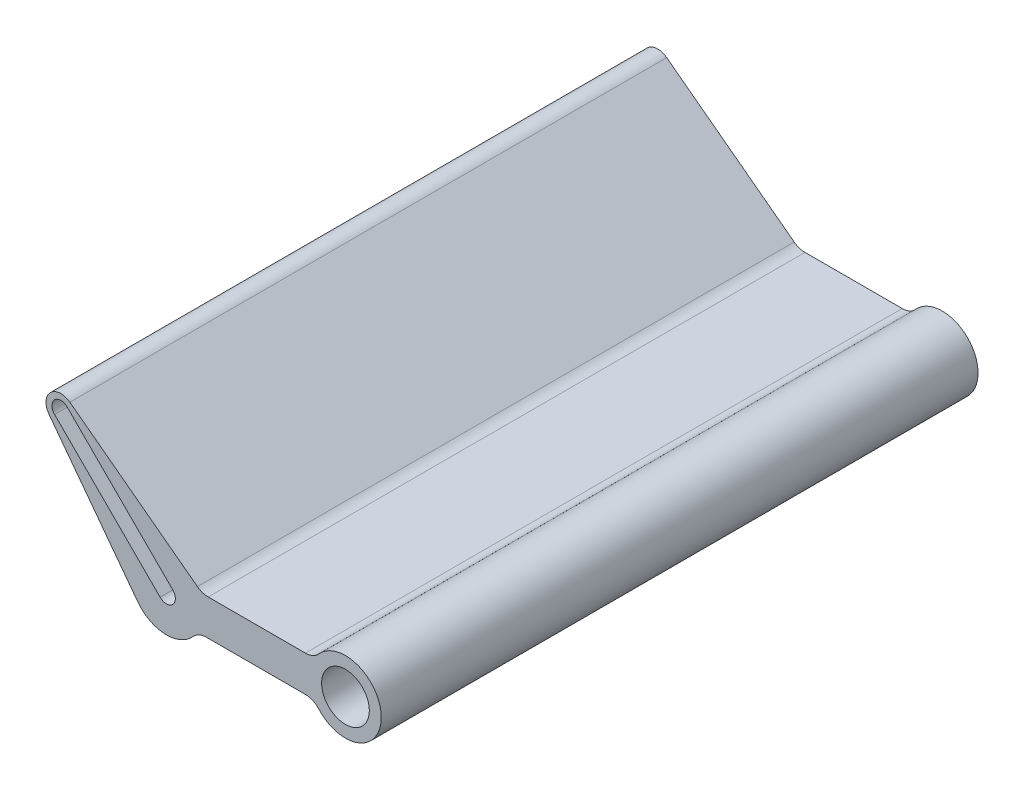
ISO-10303-21;
HEADER;
FILE_DESCRIPTION(('STEP AP214'),'2;1');
FILE_NAME('part.step','',(''),(''),'','','');
FILE_SCHEMA(('AUTOMOTIVE_DESIGN { 1 0 10303 214 1 1 1 1 }'));
ENDSEC;
DATA;
#1=APPLICATION_CONTEXT('core data for automotive mechanical design processes');
#2=APPLICATION_PROTOCOL_DEFINITION('international standard','automotive_design',2000,#1);
#3=PRODUCT_CONTEXT('',#1,'mechanical');
#4=PRODUCT('Part','Part','',(#3));
#5=PRODUCT_RELATED_PRODUCT_CATEGORY('part','',(#4));
#6=PRODUCT_DEFINITION_FORMATION('','',#4);
#7=PRODUCT_DEFINITION_CONTEXT('part definition',#1,'design');
#8=PRODUCT_DEFINITION('design','',#6,#7);
#9=PRODUCT_DEFINITION_SHAPE('','',#8);
#10=(LENGTH_UNIT() NAMED_UNIT(*) SI_UNIT(.MILLI.,.METRE.));
#11=(NAMED_UNIT(*) PLANE_ANGLE_UNIT() SI_UNIT($,.RADIAN.));
#12=(NAMED_UNIT(*) SI_UNIT($,.STERADIAN.) SOLID_ANGLE_UNIT());
#13=UNCERTAINTY_MEASURE_WITH_UNIT(LENGTH_MEASURE(1.E-05),#10,'distance_accuracy_value','');
#14=(GEOMETRIC_REPRESENTATION_CONTEXT(3) GLOBAL_UNCERTAINTY_ASSIGNED_CONTEXT((#13)) GLOBAL_UNIT_ASSIGNED_CONTEXT((#10,
#11,#12)) REPRESENTATION_CONTEXT('',''));
#15=CARTESIAN_POINT('',(0.,0.,0.));
#16=DIRECTION('',(0.,0.,1.));
#17=DIRECTION('',(1.,0.,0.));
#18=AXIS2_PLACEMENT_3D('',#15,#16,#17);
#19=CARTESIAN_POINT('',(0.,0.,1000.));
#20=DIRECTION('',(0.,0.,1.));
#21=DIRECTION('',(1.,0.,0.));
#22=AXIS2_PLACEMENT_3D('',#19,#20,#21);
#23=PLANE('',#22);
#24=DIRECTION('',(-0.707106781186547,0.707106781186548,0.));
#25=VECTOR('',#24,1.);
#26=CARTESIAN_POINT('',(10.6066017177982,10.6066017177982,1000.));
#27=LINE('',#26,#25);
#28=CARTESIAN_POINT('',(10.6066017177982,10.6066017177982,1000.));
#29=VERTEX_POINT('',#28);
#30=CARTESIAN_POINT('',(-166.170093578839,187.383297014435,1000.));
#31=VERTEX_POINT('',#30);
#32=EDGE_CURVE('E148',#29,#31,#27,.T.);
#33=ORIENTED_EDGE('',*,*,#32,.F.);
#34=CARTESIAN_POINT('',(0.,0.,1000.));
#35=DIRECTION('',(0.,0.,1.));
#36=DIRECTION('',(1.,0.,0.));
#37=AXIS2_PLACEMENT_3D('',#34,#35,#36);
#38=CIRCLE('',#37,15.);
#39=CARTESIAN_POINT('',(-10.6066017177982,-10.6066017177982,1000.));
#40=VERTEX_POINT('',#39);
#41=EDGE_CURVE('E140',#40,#29,#38,.T.);
#42=ORIENTED_EDGE('',*,*,#41,.F.);
#43=DIRECTION('',(0.707106781186548,-0.707106781186548,0.));
#44=VECTOR('',#43,1.);
#45=CARTESIAN_POINT('',(-10.6066017177982,-10.6066017177982,1000.));
#46=LINE('',#45,#44);
#47=CARTESIAN_POINT('',(-187.383297014435,166.170093578839,1000.));
#48=VERTEX_POINT('',#47);
#49=EDGE_CURVE('E163',#48,#40,#46,.T.);
#50=ORIENTED_EDGE('',*,*,#49,.F.);
#51=CARTESIAN_POINT('',(-176.776695296637,176.776695296637,1000.));
#52=DIRECTION('',(0.,0.,1.));
#53=DIRECTION('',(1.,0.,0.));
#54=AXIS2_PLACEMENT_3D('',#51,#52,#53);
#55=CIRCLE('',#54,15.);
#56=EDGE_CURVE('E161',#31,#48,#55,.T.);
#57=ORIENTED_EDGE('',*,*,#56,.F.);
#58=EDGE_LOOP('',(#33,#42,#50,#57));
#59=FACE_BOUND('',#58,.T.);
#60=CARTESIAN_POINT('',(0.,0.,1000.));
#61=DIRECTION('',(0.,0.,1.));
#62=DIRECTION('',(1.,0.,0.));
#63=AXIS2_PLACEMENT_3D('',#60,#61,#62);
#64=CIRCLE('',#63,60.);
#65=CARTESIAN_POINT('',(-47.9482675160813,-36.0688735921473,1000.));
#66=VERTEX_POINT('',#65);
#67=CARTESIAN_POINT('',(44.7213595499958,-40.,1000.));
#68=VERTEX_POINT('',#67);
#69=EDGE_CURVE('E179',#66,#68,#64,.T.);
#70=ORIENTED_EDGE('',*,*,#69,.T.);
#71=CARTESIAN_POINT('',(67.0820393249937,-60.,1000.));
#72=DIRECTION('',(0.,0.,-1.));
#73=DIRECTION('',(1.,0.,0.));
#74=AXIS2_PLACEMENT_3D('',#71,#72,#73);
#75=CIRCLE('',#74,30.);
#76=CARTESIAN_POINT('',(67.0820393249937,-30.,1000.));
#77=VERTEX_POINT('',#76);
#78=EDGE_CURVE('E182',#68,#77,#75,.T.);
#79=ORIENTED_EDGE('',*,*,#78,.T.);
#80=DIRECTION('',(1.,0.,0.));
#81=VECTOR('',#80,1.);
#82=CARTESIAN_POINT('',(67.0820393249937,-30.,1000.));
#83=LINE('',#82,#81);
#84=CARTESIAN_POINT('',(232.917960675006,-30.,1000.));
#85=VERTEX_POINT('',#84);
#86=EDGE_CURVE('E185',#77,#85,#83,.T.);
#87=ORIENTED_EDGE('',*,*,#86,.T.);
#88=CARTESIAN_POINT('',(232.917960675006,-60.,1000.));
#89=DIRECTION('',(0.,0.,-1.));
#90=DIRECTION('',(1.,0.,0.));
#91=AXIS2_PLACEMENT_3D('',#88,#89,#90);
#92=CIRCLE('',#91,30.);
#93=CARTESIAN_POINT('',(255.278640450004,-40.,1000.));
#94=VERTEX_POINT('',#93);
#95=EDGE_CURVE('E187',#85,#94,#92,.T.);
#96=ORIENTED_EDGE('',*,*,#95,.T.);
#97=CARTESIAN_POINT('',(300.,0.,1000.));
#98=DIRECTION('',(0.,0.,1.));
#99=DIRECTION('',(1.,0.,0.));
#100=AXIS2_PLACEMENT_3D('',#97,#98,#99);
#101=CIRCLE('',#100,60.);
#102=CARTESIAN_POINT('',(255.278640450004,40.,1000.));
#103=VERTEX_POINT('',#102);
#104=EDGE_CURVE('E189',#94,#103,#101,.T.);
#105=ORIENTED_EDGE('',*,*,#104,.T.);
#106=CARTESIAN_POINT('',(232.917960675006,60.,1000.));
#107=DIRECTION('',(0.,0.,-1.));
#108=DIRECTION('',(1.,0.,0.));
#109=AXIS2_PLACEMENT_3D('',#106,#107,#108);
#110=CIRCLE('',#109,30.);
#111=CARTESIAN_POINT('',(232.917960675006,30.,1000.));
#112=VERTEX_POINT('',#111);
#113=EDGE_CURVE('E191',#103,#112,#110,.T.);
#114=ORIENTED_EDGE('',*,*,#113,.T.);
#115=DIRECTION('',(-1.,0.,0.));
#116=VECTOR('',#115,1.);
#117=CARTESIAN_POINT('',(69.9523910162928,30.,1000.));
#118=LINE('',#117,#116);
#119=CARTESIAN_POINT('',(69.9523910162928,30.,1000.));
#120=VERTEX_POINT('',#119);
#121=EDGE_CURVE('E193',#112,#120,#118,.T.);
#122=ORIENTED_EDGE('',*,*,#121,.T.);
#123=CARTESIAN_POINT('',(69.9523910162927,60.,1000.));
#124=DIRECTION('',(0.,0.,-1.));
#125=DIRECTION('',(1.,0.,0.));
#126=AXIS2_PLACEMENT_3D('',#123,#124,#125);
#127=CIRCLE('',#126,30.);
#128=CARTESIAN_POINT('',(51.917954220219,36.0258662419594,1000.));
#129=VERTEX_POINT('',#128);
#130=EDGE_CURVE('E195',#120,#129,#127,.T.);
#131=ORIENTED_EDGE('',*,*,#130,.T.);
#132=DIRECTION('',(-0.799137791934689,0.601147893202455,0.));
#133=VECTOR('',#132,1.);
#134=CARTESIAN_POINT('',(51.917954220219,36.0258662419594,1000.));
#135=LINE('',#134,#133);
#136=CARTESIAN_POINT('',(-161.747997966575,196.755140095004,1000.));
#137=VERTEX_POINT('',#136);
#138=EDGE_CURVE('E197',#129,#137,#135,.T.);
#139=ORIENTED_EDGE('',*,*,#138,.T.);
#140=CARTESIAN_POINT('',(-176.776695296637,176.776695296637,1000.));
#141=DIRECTION('',(0.,0.,1.));
#142=DIRECTION('',(1.,0.,0.));
#143=AXIS2_PLACEMENT_3D('',#140,#141,#142);
#144=CIRCLE('',#143,25.);
#145=CARTESIAN_POINT('',(-196.755140095004,161.747997966575,1000.));
#146=VERTEX_POINT('',#145);
#147=EDGE_CURVE('E199',#137,#146,#144,.T.);
#148=ORIENTED_EDGE('',*,*,#147,.T.);
#149=DIRECTION('',(0.601147893202455,-0.799137791934688,0.));
#150=VECTOR('',#149,1.);
#151=CARTESIAN_POINT('',(-47.9482675160813,-36.0688735921473,1000.));
#152=LINE('',#151,#150);
#153=EDGE_CURVE('E201',#146,#66,#152,.T.);
#154=ORIENTED_EDGE('',*,*,#153,.T.);
#155=EDGE_LOOP('',(#70,#79,#87,#96,#105,#114,#122,#131,#139,#148,#154));
#156=FACE_BOUND('',#155,.T.);
#157=CARTESIAN_POINT('',(300.,0.,1000.));
#158=DIRECTION('',(0.,0.,1.));
#159=DIRECTION('',(1.,0.,0.));
#160=AXIS2_PLACEMENT_3D('',#157,#158,#159);
#161=CIRCLE('',#160,40.);
#162=CARTESIAN_POINT('',(340.,0.,1000.));
#163=VERTEX_POINT('',#162);
#164=EDGE_CURVE('E169',#163,#163,#161,.T.);
#165=ORIENTED_EDGE('',*,*,#164,.F.);
#166=EDGE_LOOP('',(#165));
#167=FACE_BOUND('',#166,.T.);
#168=ADVANCED_FACE('F33',(#59,#156,#167),#23,.T.);
#169=CARTESIAN_POINT('',(0.,0.,0.));
#170=DIRECTION('',(0.,0.,1.));
#171=DIRECTION('',(1.,0.,0.));
#172=AXIS2_PLACEMENT_3D('',#169,#170,#171);
#173=PLANE('',#172);
#174=CARTESIAN_POINT('',(0.,0.,0.));
#175=DIRECTION('',(0.,0.,1.));
#176=DIRECTION('',(1.,0.,0.));
#177=AXIS2_PLACEMENT_3D('',#174,#175,#176);
#178=CIRCLE('',#177,15.);
#179=CARTESIAN_POINT('',(-10.6066017177982,-10.6066017177982,0.));
#180=VERTEX_POINT('',#179);
#181=CARTESIAN_POINT('',(10.6066017177982,10.6066017177982,0.));
#182=VERTEX_POINT('',#181);
#183=EDGE_CURVE('E56',#180,#182,#178,.T.);
#184=ORIENTED_EDGE('',*,*,#183,.T.);
#185=DIRECTION('',(-0.707106781186547,0.707106781186548,0.));
#186=VECTOR('',#185,1.);
#187=CARTESIAN_POINT('',(10.6066017177982,10.6066017177982,0.));
#188=LINE('',#187,#186);
#189=CARTESIAN_POINT('',(-166.170093578839,187.383297014435,0.));
#190=VERTEX_POINT('',#189);
#191=EDGE_CURVE('E155',#182,#190,#188,.T.);
#192=ORIENTED_EDGE('',*,*,#191,.T.);
#193=CARTESIAN_POINT('',(-176.776695296637,176.776695296637,0.));
#194=DIRECTION('',(0.,0.,1.));
#195=DIRECTION('',(1.,0.,0.));
#196=AXIS2_PLACEMENT_3D('',#193,#194,#195);
#197=CIRCLE('',#196,15.);
#198=CARTESIAN_POINT('',(-187.383297014435,166.170093578839,0.));
#199=VERTEX_POINT('',#198);
#200=EDGE_CURVE('E171',#190,#199,#197,.T.);
#201=ORIENTED_EDGE('',*,*,#200,.T.);
#202=DIRECTION('',(0.707106781186548,-0.707106781186548,0.));
#203=VECTOR('',#202,1.);
#204=CARTESIAN_POINT('',(-10.6066017177982,-10.6066017177982,0.));
#205=LINE('',#204,#203);
#206=EDGE_CURVE('E149',#199,#180,#205,.T.);
#207=ORIENTED_EDGE('',*,*,#206,.T.);
#208=EDGE_LOOP('',(#184,#192,#201,#207));
#209=FACE_BOUND('',#208,.T.);
#210=CARTESIAN_POINT('',(0.,0.,0.));
#211=DIRECTION('',(0.,0.,1.));
#212=DIRECTION('',(1.,0.,0.));
#213=AXIS2_PLACEMENT_3D('',#210,#211,#212);
#214=CIRCLE('',#213,60.);
#215=CARTESIAN_POINT('',(-47.9482675160813,-36.0688735921473,0.));
#216=VERTEX_POINT('',#215);
#217=CARTESIAN_POINT('',(44.7213595499958,-40.,0.));
#218=VERTEX_POINT('',#217);
#219=EDGE_CURVE('E156',#216,#218,#214,.T.);
#220=ORIENTED_EDGE('',*,*,#219,.F.);
#221=DIRECTION('',(0.601147893202455,-0.799137791934688,0.));
#222=VECTOR('',#221,1.);
#223=CARTESIAN_POINT('',(-47.9482675160813,-36.0688735921473,0.));
#224=LINE('',#223,#222);
#225=CARTESIAN_POINT('',(-196.755140095004,161.747997966575,0.));
#226=VERTEX_POINT('',#225);
#227=EDGE_CURVE('E183',#226,#216,#224,.T.);
#228=ORIENTED_EDGE('',*,*,#227,.F.);
#229=CARTESIAN_POINT('',(-176.776695296637,176.776695296637,0.));
#230=DIRECTION('',(0.,0.,1.));
#231=DIRECTION('',(1.,0.,0.));
#232=AXIS2_PLACEMENT_3D('',#229,#230,#231);
#233=CIRCLE('',#232,25.);
#234=CARTESIAN_POINT('',(-161.747997966575,196.755140095004,0.));
#235=VERTEX_POINT('',#234);
#236=EDGE_CURVE('E222',#235,#226,#233,.T.);
#237=ORIENTED_EDGE('',*,*,#236,.F.);
#238=DIRECTION('',(-0.799137791934689,0.601147893202455,0.));
#239=VECTOR('',#238,1.);
#240=CARTESIAN_POINT('',(51.917954220219,36.0258662419594,0.));
#241=LINE('',#240,#239);
#242=CARTESIAN_POINT('',(51.917954220219,36.0258662419594,0.));
#243=VERTEX_POINT('',#242);
#244=EDGE_CURVE('E220',#243,#235,#241,.T.);
#245=ORIENTED_EDGE('',*,*,#244,.F.);
#246=CARTESIAN_POINT('',(69.9523910162927,60.,0.));
#247=DIRECTION('',(0.,0.,-1.));
#248=DIRECTION('',(1.,0.,0.));
#249=AXIS2_PLACEMENT_3D('',#246,#247,#248);
#250=CIRCLE('',#249,30.);
#251=CARTESIAN_POINT('',(69.9523910162928,30.,0.));
#252=VERTEX_POINT('',#251);
#253=EDGE_CURVE('E218',#252,#243,#250,.T.);
#254=ORIENTED_EDGE('',*,*,#253,.F.);
#255=DIRECTION('',(-1.,0.,0.));
#256=VECTOR('',#255,1.);
#257=CARTESIAN_POINT('',(69.9523910162928,30.,0.));
#258=LINE('',#257,#256);
#259=CARTESIAN_POINT('',(232.917960675006,30.,0.));
#260=VERTEX_POINT('',#259);
#261=EDGE_CURVE('E216',#260,#252,#258,.T.);
#262=ORIENTED_EDGE('',*,*,#261,.F.);
#263=CARTESIAN_POINT('',(232.917960675006,60.,0.));
#264=DIRECTION('',(0.,0.,-1.));
#265=DIRECTION('',(1.,0.,0.));
#266=AXIS2_PLACEMENT_3D('',#263,#264,#265);
#267=CIRCLE('',#266,30.);
#268=CARTESIAN_POINT('',(255.278640450004,40.,0.));
#269=VERTEX_POINT('',#268);
#270=EDGE_CURVE('E214',#269,#260,#267,.T.);
#271=ORIENTED_EDGE('',*,*,#270,.F.);
#272=CARTESIAN_POINT('',(300.,0.,0.));
#273=DIRECTION('',(0.,0.,1.));
#274=DIRECTION('',(1.,0.,0.));
#275=AXIS2_PLACEMENT_3D('',#272,#273,#274);
#276=CIRCLE('',#275,60.);
#277=CARTESIAN_POINT('',(255.278640450004,-40.,0.));
#278=VERTEX_POINT('',#277);
#279=EDGE_CURVE('E212',#278,#269,#276,.T.);
#280=ORIENTED_EDGE('',*,*,#279,.F.);
#281=CARTESIAN_POINT('',(232.917960675006,-60.,0.));
#282=DIRECTION('',(0.,0.,-1.));
#283=DIRECTION('',(1.,0.,0.));
#284=AXIS2_PLACEMENT_3D('',#281,#282,#283);
#285=CIRCLE('',#284,30.);
#286=CARTESIAN_POINT('',(232.917960675006,-30.,0.));
#287=VERTEX_POINT('',#286);
#288=EDGE_CURVE('E210',#287,#278,#285,.T.);
#289=ORIENTED_EDGE('',*,*,#288,.F.);
#290=DIRECTION('',(1.,0.,0.));
#291=VECTOR('',#290,1.);
#292=CARTESIAN_POINT('',(67.0820393249937,-30.,0.));
#293=LINE('',#292,#291);
#294=CARTESIAN_POINT('',(67.0820393249937,-30.,0.));
#295=VERTEX_POINT('',#294);
#296=EDGE_CURVE('E208',#295,#287,#293,.T.);
#297=ORIENTED_EDGE('',*,*,#296,.F.);
#298=CARTESIAN_POINT('',(67.0820393249937,-60.,0.));
#299=DIRECTION('',(0.,0.,-1.));
#300=DIRECTION('',(1.,0.,0.));
#301=AXIS2_PLACEMENT_3D('',#298,#299,#300);
#302=CIRCLE('',#301,30.);
#303=EDGE_CURVE('E206',#218,#295,#302,.T.);
#304=ORIENTED_EDGE('',*,*,#303,.F.);
#305=EDGE_LOOP('',(#220,#228,#237,#245,#254,#262,#271,#280,#289,#297,#304));
#306=FACE_BOUND('',#305,.T.);
#307=CARTESIAN_POINT('',(300.,0.,0.));
#308=DIRECTION('',(0.,0.,1.));
#309=DIRECTION('',(1.,0.,0.));
#310=AXIS2_PLACEMENT_3D('',#307,#308,#309);
#311=CIRCLE('',#310,40.);
#312=CARTESIAN_POINT('',(340.,0.,0.));
#313=VERTEX_POINT('',#312);
#314=EDGE_CURVE('E460',#313,#313,#311,.T.);
#315=ORIENTED_EDGE('',*,*,#314,.T.);
#316=EDGE_LOOP('',(#315));
#317=FACE_BOUND('',#316,.T.);
#318=ADVANCED_FACE('F261',(#209,#306,#317),#173,.F.);
#319=CARTESIAN_POINT('',(0.,0.,1000.));
#320=DIRECTION('',(0.,0.,-1.));
#321=DIRECTION('',(-1.,0.,0.));
#322=AXIS2_PLACEMENT_3D('',#319,#320,#321);
#323=CYLINDRICAL_SURFACE('',#322,60.);
#324=ORIENTED_EDGE('',*,*,#219,.T.);
#325=DIRECTION('',(0.,0.,-1.));
#326=VECTOR('',#325,1.);
#327=CARTESIAN_POINT('',(44.7213595499958,-40.,1000.));
#328=LINE('',#327,#326);
#329=EDGE_CURVE('E11',#68,#218,#328,.T.);
#330=ORIENTED_EDGE('',*,*,#329,.F.);
#331=ORIENTED_EDGE('',*,*,#69,.F.);
#332=DIRECTION('',(0.,0.,-1.));
#333=VECTOR('',#332,1.);
#334=CARTESIAN_POINT('',(-47.9482675160813,-36.0688735921473,1000.));
#335=LINE('',#334,#333);
#336=EDGE_CURVE('E203',#66,#216,#335,.T.);
#337=ORIENTED_EDGE('',*,*,#336,.T.);
#338=EDGE_LOOP('',(#324,#330,#331,#337));
#339=FACE_BOUND('',#338,.T.);
#340=ADVANCED_FACE('F35',(#339),#323,.T.);
#341=CARTESIAN_POINT('',(67.0820393249937,-60.,1000.));
#342=DIRECTION('',(0.,0.,-1.));
#343=DIRECTION('',(-1.,0.,0.));
#344=AXIS2_PLACEMENT_3D('',#341,#342,#343);
#345=CYLINDRICAL_SURFACE('',#344,30.);
#346=ORIENTED_EDGE('',*,*,#303,.T.);
#347=DIRECTION('',(0.,0.,-1.));
#348=VECTOR('',#347,1.);
#349=CARTESIAN_POINT('',(67.0820393249937,-30.,1000.));
#350=LINE('',#349,#348);
#351=EDGE_CURVE('E41',#77,#295,#350,.T.);
#352=ORIENTED_EDGE('',*,*,#351,.F.);
#353=ORIENTED_EDGE('',*,*,#78,.F.);
#354=ORIENTED_EDGE('',*,*,#329,.T.);
#355=EDGE_LOOP('',(#346,#352,#353,#354));
#356=FACE_BOUND('',#355,.T.);
#357=ADVANCED_FACE('F278',(#356),#345,.F.);
#358=CARTESIAN_POINT('',(67.0820393249937,-30.,1000.));
#359=DIRECTION('',(0.,1.,0.));
#360=DIRECTION('',(0.,0.,1.));
#361=AXIS2_PLACEMENT_3D('',#358,#359,#360);
#362=PLANE('',#361);
#363=ORIENTED_EDGE('',*,*,#296,.T.);
#364=DIRECTION('',(0.,0.,-1.));
#365=VECTOR('',#364,1.);
#366=CARTESIAN_POINT('',(232.917960675006,-30.,1000.));
#367=LINE('',#366,#365);
#368=EDGE_CURVE('E248',#85,#287,#367,.T.);
#369=ORIENTED_EDGE('',*,*,#368,.F.);
#370=ORIENTED_EDGE('',*,*,#86,.F.);
#371=ORIENTED_EDGE('',*,*,#351,.T.);
#372=EDGE_LOOP('',(#363,#369,#370,#371));
#373=FACE_BOUND('',#372,.T.);
#374=ADVANCED_FACE('F255',(#373),#362,.F.);
#375=CARTESIAN_POINT('',(232.917960675006,-60.,1000.));
#376=DIRECTION('',(0.,0.,-1.));
#377=DIRECTION('',(-1.,0.,0.));
#378=AXIS2_PLACEMENT_3D('',#375,#376,#377);
#379=CYLINDRICAL_SURFACE('',#378,30.);
#380=ORIENTED_EDGE('',*,*,#288,.T.);
#381=DIRECTION('',(0.,0.,-1.));
#382=VECTOR('',#381,1.);
#383=CARTESIAN_POINT('',(255.278640450004,-40.,1000.));
#384=LINE('',#383,#382);
#385=EDGE_CURVE('E245',#94,#278,#384,.T.);
#386=ORIENTED_EDGE('',*,*,#385,.F.);
#387=ORIENTED_EDGE('',*,*,#95,.F.);
#388=ORIENTED_EDGE('',*,*,#368,.T.);
#389=EDGE_LOOP('',(#380,#386,#387,#388));
#390=FACE_BOUND('',#389,.T.);
#391=ADVANCED_FACE('F267',(#390),#379,.F.);
#392=CARTESIAN_POINT('',(300.,0.,1000.));
#393=DIRECTION('',(0.,0.,-1.));
#394=DIRECTION('',(-1.,0.,0.));
#395=AXIS2_PLACEMENT_3D('',#392,#393,#394);
#396=CYLINDRICAL_SURFACE('',#395,60.);
#397=ORIENTED_EDGE('',*,*,#279,.T.);
#398=DIRECTION('',(0.,0.,-1.));
#399=VECTOR('',#398,1.);
#400=CARTESIAN_POINT('',(255.278640450004,40.,1000.));
#401=LINE('',#400,#399);
#402=EDGE_CURVE('E242',#103,#269,#401,.T.);
#403=ORIENTED_EDGE('',*,*,#402,.F.);
#404=ORIENTED_EDGE('',*,*,#104,.F.);
#405=ORIENTED_EDGE('',*,*,#385,.T.);
#406=EDGE_LOOP('',(#397,#403,#404,#405));
#407=FACE_BOUND('',#406,.T.);
#408=ADVANCED_FACE('F271',(#407),#396,.T.);
#409=CARTESIAN_POINT('',(232.917960675006,60.,1000.));
#410=DIRECTION('',(0.,0.,-1.));
#411=DIRECTION('',(-1.,0.,0.));
#412=AXIS2_PLACEMENT_3D('',#409,#410,#411);
#413=CYLINDRICAL_SURFACE('',#412,30.);
#414=ORIENTED_EDGE('',*,*,#270,.T.);
#415=DIRECTION('',(0.,0.,-1.));
#416=VECTOR('',#415,1.);
#417=CARTESIAN_POINT('',(232.917960675006,30.,1000.));
#418=LINE('',#417,#416);
#419=EDGE_CURVE('E239',#112,#260,#418,.T.);
#420=ORIENTED_EDGE('',*,*,#419,.F.);
#421=ORIENTED_EDGE('',*,*,#113,.F.);
#422=ORIENTED_EDGE('',*,*,#402,.T.);
#423=EDGE_LOOP('',(#414,#420,#421,#422));
#424=FACE_BOUND('',#423,.T.);
#425=ADVANCED_FACE('F306',(#424),#413,.F.);
#426=CARTESIAN_POINT('',(69.9523910162928,30.,1000.));
#427=DIRECTION('',(0.,-1.,0.));
#428=DIRECTION('',(1.,0.,0.));
#429=AXIS2_PLACEMENT_3D('',#426,#427,#428);
#430=PLANE('',#429);
#431=ORIENTED_EDGE('',*,*,#261,.T.);
#432=DIRECTION('',(0.,0.,-1.));
#433=VECTOR('',#432,1.);
#434=CARTESIAN_POINT('',(69.9523910162928,30.,1000.));
#435=LINE('',#434,#433);
#436=EDGE_CURVE('E236',#120,#252,#435,.T.);
#437=ORIENTED_EDGE('',*,*,#436,.F.);
#438=ORIENTED_EDGE('',*,*,#121,.F.);
#439=ORIENTED_EDGE('',*,*,#419,.T.);
#440=EDGE_LOOP('',(#431,#437,#438,#439));
#441=FACE_BOUND('',#440,.T.);
#442=ADVANCED_FACE('F304',(#441),#430,.F.);
#443=CARTESIAN_POINT('',(69.9523910162927,60.,1000.));
#444=DIRECTION('',(0.,0.,-1.));
#445=DIRECTION('',(-1.,0.,0.));
#446=AXIS2_PLACEMENT_3D('',#443,#444,#445);
#447=CYLINDRICAL_SURFACE('',#446,30.);
#448=ORIENTED_EDGE('',*,*,#253,.T.);
#449=DIRECTION('',(0.,0.,-1.));
#450=VECTOR('',#449,1.);
#451=CARTESIAN_POINT('',(51.917954220219,36.0258662419594,1000.));
#452=LINE('',#451,#450);
#453=EDGE_CURVE('E233',#129,#243,#452,.T.);
#454=ORIENTED_EDGE('',*,*,#453,.F.);
#455=ORIENTED_EDGE('',*,*,#130,.F.);
#456=ORIENTED_EDGE('',*,*,#436,.T.);
#457=EDGE_LOOP('',(#448,#454,#455,#456));
#458=FACE_BOUND('',#457,.T.);
#459=ADVANCED_FACE('F299',(#458),#447,.F.);
#460=CARTESIAN_POINT('',(51.917954220219,36.0258662419594,1000.));
#461=DIRECTION('',(-0.601147893202455,-0.799137791934689,0.));
#462=DIRECTION('',(0.799137791934689,-0.601147893202455,0.));
#463=AXIS2_PLACEMENT_3D('',#460,#461,#462);
#464=PLANE('',#463);
#465=ORIENTED_EDGE('',*,*,#244,.T.);
#466=DIRECTION('',(0.,0.,-1.));
#467=VECTOR('',#466,1.);
#468=CARTESIAN_POINT('',(-161.747997966575,196.755140095004,1000.));
#469=LINE('',#468,#467);
#470=EDGE_CURVE('E230',#137,#235,#469,.T.);
#471=ORIENTED_EDGE('',*,*,#470,.F.);
#472=ORIENTED_EDGE('',*,*,#138,.F.);
#473=ORIENTED_EDGE('',*,*,#453,.T.);
#474=EDGE_LOOP('',(#465,#471,#472,#473));
#475=FACE_BOUND('',#474,.T.);
#476=ADVANCED_FACE('F294',(#475),#464,.F.);
#477=CARTESIAN_POINT('',(-176.776695296637,176.776695296637,1000.));
#478=DIRECTION('',(0.,0.,-1.));
#479=DIRECTION('',(-1.,0.,0.));
#480=AXIS2_PLACEMENT_3D('',#477,#478,#479);
#481=CYLINDRICAL_SURFACE('',#480,25.);
#482=ORIENTED_EDGE('',*,*,#236,.T.);
#483=DIRECTION('',(0.,0.,-1.));
#484=VECTOR('',#483,1.);
#485=CARTESIAN_POINT('',(-196.755140095004,161.747997966575,1000.));
#486=LINE('',#485,#484);
#487=EDGE_CURVE('E227',#146,#226,#486,.T.);
#488=ORIENTED_EDGE('',*,*,#487,.F.);
#489=ORIENTED_EDGE('',*,*,#147,.F.);
#490=ORIENTED_EDGE('',*,*,#470,.T.);
#491=EDGE_LOOP('',(#482,#488,#489,#490));
#492=FACE_BOUND('',#491,.T.);
#493=ADVANCED_FACE('F290',(#492),#481,.T.);
#494=CARTESIAN_POINT('',(-47.9482675160813,-36.0688735921473,1000.));
#495=DIRECTION('',(0.799137791934689,0.601147893202455,0.));
#496=DIRECTION('',(-0.601147893202455,0.799137791934688,0.));
#497=AXIS2_PLACEMENT_3D('',#494,#495,#496);
#498=PLANE('',#497);
#499=ORIENTED_EDGE('',*,*,#227,.T.);
#500=ORIENTED_EDGE('',*,*,#336,.F.);
#501=ORIENTED_EDGE('',*,*,#153,.F.);
#502=ORIENTED_EDGE('',*,*,#487,.T.);
#503=EDGE_LOOP('',(#499,#500,#501,#502));
#504=FACE_BOUND('',#503,.T.);
#505=ADVANCED_FACE('F285',(#504),#498,.F.);
#506=CARTESIAN_POINT('',(0.,0.,1000.));
#507=DIRECTION('',(0.,0.,-1.));
#508=DIRECTION('',(-1.,0.,0.));
#509=AXIS2_PLACEMENT_3D('',#506,#507,#508);
#510=CYLINDRICAL_SURFACE('',#509,15.);
#511=ORIENTED_EDGE('',*,*,#183,.F.);
#512=DIRECTION('',(0.,0.,-1.));
#513=VECTOR('',#512,1.);
#514=CARTESIAN_POINT('',(-10.6066017177982,-10.6066017177982,1000.));
#515=LINE('',#514,#513);
#516=EDGE_CURVE('E144',#40,#180,#515,.T.);
#517=ORIENTED_EDGE('',*,*,#516,.F.);
#518=ORIENTED_EDGE('',*,*,#41,.T.);
#519=DIRECTION('',(0.,0.,-1.));
#520=VECTOR('',#519,1.);
#521=CARTESIAN_POINT('',(10.6066017177982,10.6066017177982,1000.));
#522=LINE('',#521,#520);
#523=EDGE_CURVE('E143',#29,#182,#522,.T.);
#524=ORIENTED_EDGE('',*,*,#523,.T.);
#525=EDGE_LOOP('',(#511,#517,#518,#524));
#526=FACE_BOUND('',#525,.T.);
#527=ADVANCED_FACE('F142',(#526),#510,.F.);
#528=CARTESIAN_POINT('',(10.6066017177982,10.6066017177982,1000.));
#529=DIRECTION('',(-0.707106781186548,-0.707106781186547,0.));
#530=DIRECTION('',(0.707106781186547,-0.707106781186548,0.));
#531=AXIS2_PLACEMENT_3D('',#528,#529,#530);
#532=PLANE('',#531);
#533=ORIENTED_EDGE('',*,*,#191,.F.);
#534=ORIENTED_EDGE('',*,*,#523,.F.);
#535=ORIENTED_EDGE('',*,*,#32,.T.);
#536=DIRECTION('',(0.,0.,-1.));
#537=VECTOR('',#536,1.);
#538=CARTESIAN_POINT('',(-166.170093578839,187.383297014435,1000.));
#539=LINE('',#538,#537);
#540=EDGE_CURVE('E157',#31,#190,#539,.T.);
#541=ORIENTED_EDGE('',*,*,#540,.T.);
#542=EDGE_LOOP('',(#533,#534,#535,#541));
#543=FACE_BOUND('',#542,.T.);
#544=ADVANCED_FACE('F152',(#543),#532,.T.);
#545=CARTESIAN_POINT('',(-176.776695296637,176.776695296637,1000.));
#546=DIRECTION('',(0.,0.,-1.));
#547=DIRECTION('',(-1.,0.,0.));
#548=AXIS2_PLACEMENT_3D('',#545,#546,#547);
#549=CYLINDRICAL_SURFACE('',#548,15.);
#550=ORIENTED_EDGE('',*,*,#200,.F.);
#551=ORIENTED_EDGE('',*,*,#540,.F.);
#552=ORIENTED_EDGE('',*,*,#56,.T.);
#553=DIRECTION('',(0.,0.,-1.));
#554=VECTOR('',#553,1.);
#555=CARTESIAN_POINT('',(-187.383297014435,166.170093578839,1000.));
#556=LINE('',#555,#554);
#557=EDGE_CURVE('E48',#48,#199,#556,.T.);
#558=ORIENTED_EDGE('',*,*,#557,.T.);
#559=EDGE_LOOP('',(#550,#551,#552,#558));
#560=FACE_BOUND('',#559,.T.);
#561=ADVANCED_FACE('F359',(#560),#549,.F.);
#562=CARTESIAN_POINT('',(-10.6066017177982,-10.6066017177982,1000.));
#563=DIRECTION('',(0.707106781186548,0.707106781186548,0.));
#564=DIRECTION('',(-0.707106781186548,0.707106781186548,0.));
#565=AXIS2_PLACEMENT_3D('',#562,#563,#564);
#566=PLANE('',#565);
#567=ORIENTED_EDGE('',*,*,#206,.F.);
#568=ORIENTED_EDGE('',*,*,#557,.F.);
#569=ORIENTED_EDGE('',*,*,#49,.T.);
#570=ORIENTED_EDGE('',*,*,#516,.T.);
#571=EDGE_LOOP('',(#567,#568,#569,#570));
#572=FACE_BOUND('',#571,.T.);
#573=ADVANCED_FACE('F365',(#572),#566,.T.);
#574=CARTESIAN_POINT('',(300.,0.,1000.));
#575=DIRECTION('',(0.,0.,-1.));
#576=DIRECTION('',(-1.,0.,0.));
#577=AXIS2_PLACEMENT_3D('',#574,#575,#576);
#578=CYLINDRICAL_SURFACE('',#577,40.);
#579=ORIENTED_EDGE('',*,*,#164,.T.);
#580=EDGE_LOOP('',(#579));
#581=FACE_BOUND('',#580,.T.);
#582=ORIENTED_EDGE('',*,*,#314,.F.);
#583=EDGE_LOOP('',(#582));
#584=FACE_BOUND('',#583,.T.);
#585=ADVANCED_FACE('F373',(#581,#584),#578,.F.);
#586=CLOSED_SHELL('',(#168,#318,#340,#357,#374,#391,#408,#425,#442,#459,#476,#493,#505,#527,
#544,#561,#573,#585));
#587=MANIFOLD_SOLID_BREP('B2',#586);
#588=ADVANCED_BREP_SHAPE_REPRESENTATION('',(#18,#587),#14);
#589=SHAPE_DEFINITION_REPRESENTATION(#9,#588);
ENDSEC;
END-ISO-10303-21;
